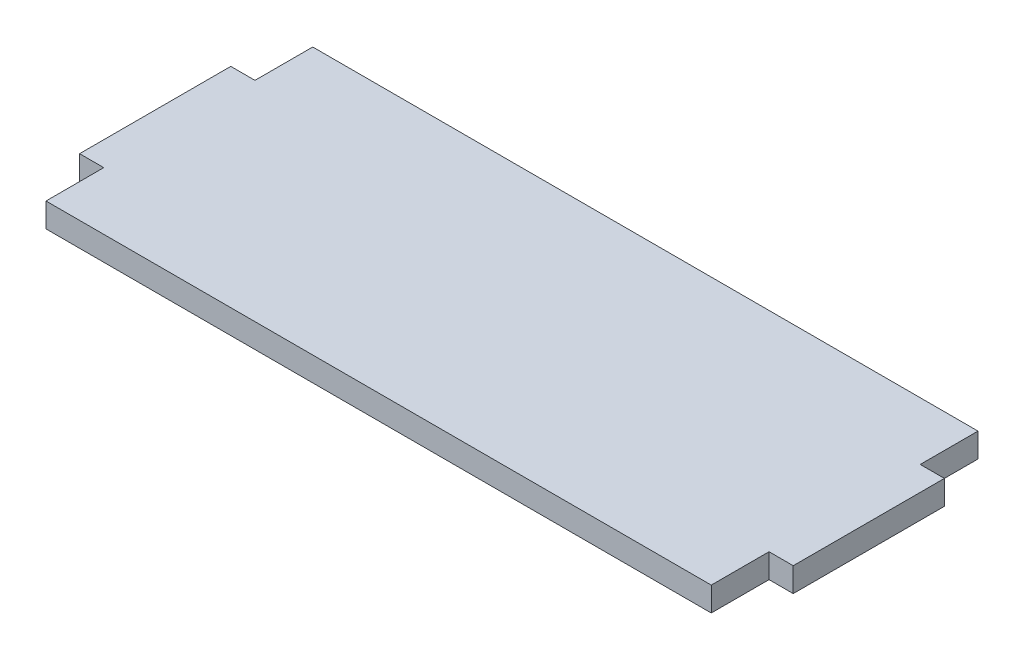
ISO-10303-21;
HEADER;
FILE_DESCRIPTION(('STEP AP214'),'2;1');
FILE_NAME('part.step','',(''),(''),'','','');
FILE_SCHEMA(('AUTOMOTIVE_DESIGN { 1 0 10303 214 1 1 1 1 }'));
ENDSEC;
DATA;
#1=APPLICATION_CONTEXT('core data for automotive mechanical design processes');
#2=APPLICATION_PROTOCOL_DEFINITION('international standard','automotive_design',2000,#1);
#3=PRODUCT_CONTEXT('',#1,'mechanical');
#4=PRODUCT('Part','Part','',(#3));
#5=PRODUCT_RELATED_PRODUCT_CATEGORY('part','',(#4));
#6=PRODUCT_DEFINITION_FORMATION('','',#4);
#7=PRODUCT_DEFINITION_CONTEXT('part definition',#1,'design');
#8=PRODUCT_DEFINITION('design','',#6,#7);
#9=PRODUCT_DEFINITION_SHAPE('','',#8);
#10=(LENGTH_UNIT() NAMED_UNIT(*) SI_UNIT(.MILLI.,.METRE.));
#11=(NAMED_UNIT(*) PLANE_ANGLE_UNIT() SI_UNIT($,.RADIAN.));
#12=(NAMED_UNIT(*) SI_UNIT($,.STERADIAN.) SOLID_ANGLE_UNIT());
#13=UNCERTAINTY_MEASURE_WITH_UNIT(LENGTH_MEASURE(1.E-05),#10,'distance_accuracy_value','');
#14=(GEOMETRIC_REPRESENTATION_CONTEXT(3) GLOBAL_UNCERTAINTY_ASSIGNED_CONTEXT((#13)) GLOBAL_UNIT_ASSIGNED_CONTEXT((#10,
#11,#12)) REPRESENTATION_CONTEXT('',''));
#15=CARTESIAN_POINT('',(0.,0.,0.));
#16=DIRECTION('',(0.,0.,1.));
#17=DIRECTION('',(1.,0.,0.));
#18=AXIS2_PLACEMENT_3D('',#15,#16,#17);
#19=CARTESIAN_POINT('',(-8.00000000000001,8.,0.));
#20=DIRECTION('',(1.,0.,0.));
#21=DIRECTION('',(0.,0.,-1.));
#22=AXIS2_PLACEMENT_3D('',#19,#20,#21);
#23=PLANE('',#22);
#24=DIRECTION('',(0.,0.,1.));
#25=VECTOR('',#24,1.);
#26=CARTESIAN_POINT('',(-8.00000000000001,0.,0.));
#27=LINE('',#26,#25);
#28=CARTESIAN_POINT('',(-8.,0.,-69.105));
#29=VERTEX_POINT('',#28);
#30=CARTESIAN_POINT('',(-8.00000000000001,0.,-19.105));
#31=VERTEX_POINT('',#30);
#32=EDGE_CURVE('E202',#29,#31,#27,.T.);
#33=ORIENTED_EDGE('',*,*,#32,.T.);
#34=DIRECTION('',(0.,-1.,0.));
#35=VECTOR('',#34,1.);
#36=CARTESIAN_POINT('',(-8.00000000000001,8.,-19.105));
#37=LINE('',#36,#35);
#38=CARTESIAN_POINT('',(-8.00000000000001,8.,-19.105));
#39=VERTEX_POINT('',#38);
#40=EDGE_CURVE('E11',#39,#31,#37,.T.);
#41=ORIENTED_EDGE('',*,*,#40,.F.);
#42=DIRECTION('',(0.,0.,1.));
#43=VECTOR('',#42,1.);
#44=CARTESIAN_POINT('',(-8.00000000000001,8.,0.));
#45=LINE('',#44,#43);
#46=CARTESIAN_POINT('',(-8.,8.,-69.105));
#47=VERTEX_POINT('',#46);
#48=EDGE_CURVE('E167',#47,#39,#45,.T.);
#49=ORIENTED_EDGE('',*,*,#48,.F.);
#50=DIRECTION('',(0.,-1.,0.));
#51=VECTOR('',#50,1.);
#52=CARTESIAN_POINT('',(-8.,8.,-69.105));
#53=LINE('',#52,#51);
#54=EDGE_CURVE('E57',#47,#29,#53,.T.);
#55=ORIENTED_EDGE('',*,*,#54,.T.);
#56=EDGE_LOOP('',(#33,#41,#49,#55));
#57=FACE_BOUND('',#56,.T.);
#58=ADVANCED_FACE('F41',(#57),#23,.F.);
#59=CARTESIAN_POINT('',(0.,8.,-19.105));
#60=DIRECTION('',(0.,0.,-1.));
#61=DIRECTION('',(-1.,0.,0.));
#62=AXIS2_PLACEMENT_3D('',#59,#60,#61);
#63=PLANE('',#62);
#64=DIRECTION('',(1.,0.,0.));
#65=VECTOR('',#64,1.);
#66=CARTESIAN_POINT('',(0.,0.,-19.105));
#67=LINE('',#66,#65);
#68=CARTESIAN_POINT('',(0.,0.,-19.105));
#69=VERTEX_POINT('',#68);
#70=EDGE_CURVE('E200',#31,#69,#67,.T.);
#71=ORIENTED_EDGE('',*,*,#70,.T.);
#72=DIRECTION('',(0.,-1.,0.));
#73=VECTOR('',#72,1.);
#74=CARTESIAN_POINT('',(0.,8.,-19.105));
#75=LINE('',#74,#73);
#76=CARTESIAN_POINT('',(0.,8.,-19.105));
#77=VERTEX_POINT('',#76);
#78=EDGE_CURVE('E49',#77,#69,#75,.T.);
#79=ORIENTED_EDGE('',*,*,#78,.F.);
#80=DIRECTION('',(1.,0.,0.));
#81=VECTOR('',#80,1.);
#82=CARTESIAN_POINT('',(0.,8.,-19.105));
#83=LINE('',#82,#81);
#84=EDGE_CURVE('E107',#39,#77,#83,.T.);
#85=ORIENTED_EDGE('',*,*,#84,.F.);
#86=ORIENTED_EDGE('',*,*,#40,.T.);
#87=EDGE_LOOP('',(#71,#79,#85,#86));
#88=FACE_BOUND('',#87,.T.);
#89=ADVANCED_FACE('F201',(#88),#63,.F.);
#90=CARTESIAN_POINT('',(0.,8.,0.));
#91=DIRECTION('',(-1.,0.,0.));
#92=DIRECTION('',(0.,0.,1.));
#93=AXIS2_PLACEMENT_3D('',#90,#91,#92);
#94=PLANE('',#93);
#95=DIRECTION('',(0.,0.,-1.));
#96=VECTOR('',#95,1.);
#97=CARTESIAN_POINT('',(0.,0.,0.));
#98=LINE('',#97,#96);
#99=CARTESIAN_POINT('',(0.,0.,0.));
#100=VERTEX_POINT('',#99);
#101=EDGE_CURVE('E176',#100,#69,#98,.T.);
#102=ORIENTED_EDGE('',*,*,#101,.F.);
#103=DIRECTION('',(0.,-1.,0.));
#104=VECTOR('',#103,1.);
#105=CARTESIAN_POINT('',(0.,8.,0.));
#106=LINE('',#105,#104);
#107=CARTESIAN_POINT('',(0.,8.,0.));
#108=VERTEX_POINT('',#107);
#109=EDGE_CURVE('E195',#108,#100,#106,.T.);
#110=ORIENTED_EDGE('',*,*,#109,.F.);
#111=DIRECTION('',(0.,0.,-1.));
#112=VECTOR('',#111,1.);
#113=CARTESIAN_POINT('',(0.,8.,0.));
#114=LINE('',#113,#112);
#115=EDGE_CURVE('E158',#108,#77,#114,.T.);
#116=ORIENTED_EDGE('',*,*,#115,.T.);
#117=ORIENTED_EDGE('',*,*,#78,.T.);
#118=EDGE_LOOP('',(#102,#110,#116,#117));
#119=FACE_BOUND('',#118,.T.);
#120=ADVANCED_FACE('F198',(#119),#94,.T.);
#121=CARTESIAN_POINT('',(0.,8.,0.));
#122=DIRECTION('',(0.,0.,-1.));
#123=DIRECTION('',(-1.,0.,0.));
#124=AXIS2_PLACEMENT_3D('',#121,#122,#123);
#125=PLANE('',#124);
#126=DIRECTION('',(1.,0.,0.));
#127=VECTOR('',#126,1.);
#128=CARTESIAN_POINT('',(0.,0.,0.));
#129=LINE('',#128,#127);
#130=CARTESIAN_POINT('',(220.,0.,0.));
#131=VERTEX_POINT('',#130);
#132=EDGE_CURVE('E207',#100,#131,#129,.T.);
#133=ORIENTED_EDGE('',*,*,#132,.T.);
#134=DIRECTION('',(0.,-1.,0.));
#135=VECTOR('',#134,1.);
#136=CARTESIAN_POINT('',(220.,8.,0.));
#137=LINE('',#136,#135);
#138=CARTESIAN_POINT('',(220.,8.,0.));
#139=VERTEX_POINT('',#138);
#140=EDGE_CURVE('E192',#139,#131,#137,.T.);
#141=ORIENTED_EDGE('',*,*,#140,.F.);
#142=DIRECTION('',(1.,0.,0.));
#143=VECTOR('',#142,1.);
#144=CARTESIAN_POINT('',(0.,8.,0.));
#145=LINE('',#144,#143);
#146=EDGE_CURVE('E163',#108,#139,#145,.T.);
#147=ORIENTED_EDGE('',*,*,#146,.F.);
#148=ORIENTED_EDGE('',*,*,#109,.T.);
#149=EDGE_LOOP('',(#133,#141,#147,#148));
#150=FACE_BOUND('',#149,.T.);
#151=ADVANCED_FACE('F246',(#150),#125,.F.);
#152=CARTESIAN_POINT('',(220.,8.,0.));
#153=DIRECTION('',(-1.,0.,0.));
#154=DIRECTION('',(0.,0.,1.));
#155=AXIS2_PLACEMENT_3D('',#152,#153,#154);
#156=PLANE('',#155);
#157=DIRECTION('',(0.,0.,-1.));
#158=VECTOR('',#157,1.);
#159=CARTESIAN_POINT('',(220.,0.,0.));
#160=LINE('',#159,#158);
#161=CARTESIAN_POINT('',(220.,0.,-19.105));
#162=VERTEX_POINT('',#161);
#163=EDGE_CURVE('E208',#131,#162,#160,.T.);
#164=ORIENTED_EDGE('',*,*,#163,.T.);
#165=DIRECTION('',(0.,-1.,0.));
#166=VECTOR('',#165,1.);
#167=CARTESIAN_POINT('',(220.,8.,-19.105));
#168=LINE('',#167,#166);
#169=CARTESIAN_POINT('',(220.,8.,-19.105));
#170=VERTEX_POINT('',#169);
#171=EDGE_CURVE('E190',#170,#162,#168,.T.);
#172=ORIENTED_EDGE('',*,*,#171,.F.);
#173=DIRECTION('',(0.,0.,-1.));
#174=VECTOR('',#173,1.);
#175=CARTESIAN_POINT('',(220.,8.,0.));
#176=LINE('',#175,#174);
#177=EDGE_CURVE('E166',#139,#170,#176,.T.);
#178=ORIENTED_EDGE('',*,*,#177,.F.);
#179=ORIENTED_EDGE('',*,*,#140,.T.);
#180=EDGE_LOOP('',(#164,#172,#178,#179));
#181=FACE_BOUND('',#180,.T.);
#182=ADVANCED_FACE('F241',(#181),#156,.F.);
#183=CARTESIAN_POINT('',(0.,8.,-19.105));
#184=DIRECTION('',(0.,0.,1.));
#185=DIRECTION('',(1.,0.,0.));
#186=AXIS2_PLACEMENT_3D('',#183,#184,#185);
#187=PLANE('',#186);
#188=DIRECTION('',(-1.,0.,0.));
#189=VECTOR('',#188,1.);
#190=CARTESIAN_POINT('',(0.,0.,-19.105));
#191=LINE('',#190,#189);
#192=CARTESIAN_POINT('',(228.,0.,-19.105));
#193=VERTEX_POINT('',#192);
#194=EDGE_CURVE('E214',#193,#162,#191,.T.);
#195=ORIENTED_EDGE('',*,*,#194,.F.);
#196=DIRECTION('',(0.,-1.,0.));
#197=VECTOR('',#196,1.);
#198=CARTESIAN_POINT('',(228.,8.,-19.105));
#199=LINE('',#198,#197);
#200=CARTESIAN_POINT('',(228.,8.,-19.105));
#201=VERTEX_POINT('',#200);
#202=EDGE_CURVE('E188',#201,#193,#199,.T.);
#203=ORIENTED_EDGE('',*,*,#202,.F.);
#204=DIRECTION('',(-1.,0.,0.));
#205=VECTOR('',#204,1.);
#206=CARTESIAN_POINT('',(0.,8.,-19.105));
#207=LINE('',#206,#205);
#208=EDGE_CURVE('E247',#201,#170,#207,.T.);
#209=ORIENTED_EDGE('',*,*,#208,.T.);
#210=ORIENTED_EDGE('',*,*,#171,.T.);
#211=EDGE_LOOP('',(#195,#203,#209,#210));
#212=FACE_BOUND('',#211,.T.);
#213=ADVANCED_FACE('F238',(#212),#187,.T.);
#214=CARTESIAN_POINT('',(228.,8.,-1.26565424807268E-13));
#215=DIRECTION('',(1.,0.,0.));
#216=DIRECTION('',(0.,0.,-1.));
#217=AXIS2_PLACEMENT_3D('',#214,#215,#216);
#218=PLANE('',#217);
#219=DIRECTION('',(0.,0.,1.));
#220=VECTOR('',#219,1.);
#221=CARTESIAN_POINT('',(228.,0.,-1.26565424807268E-13));
#222=LINE('',#221,#220);
#223=CARTESIAN_POINT('',(228.,0.,-69.105));
#224=VERTEX_POINT('',#223);
#225=EDGE_CURVE('E218',#224,#193,#222,.T.);
#226=ORIENTED_EDGE('',*,*,#225,.F.);
#227=DIRECTION('',(0.,-1.,0.));
#228=VECTOR('',#227,1.);
#229=CARTESIAN_POINT('',(228.,8.,-69.105));
#230=LINE('',#229,#228);
#231=CARTESIAN_POINT('',(228.,8.,-69.105));
#232=VERTEX_POINT('',#231);
#233=EDGE_CURVE('E186',#232,#224,#230,.T.);
#234=ORIENTED_EDGE('',*,*,#233,.F.);
#235=DIRECTION('',(0.,0.,1.));
#236=VECTOR('',#235,1.);
#237=CARTESIAN_POINT('',(228.,8.,-1.26565424807268E-13));
#238=LINE('',#237,#236);
#239=EDGE_CURVE('E234',#232,#201,#238,.T.);
#240=ORIENTED_EDGE('',*,*,#239,.T.);
#241=ORIENTED_EDGE('',*,*,#202,.T.);
#242=EDGE_LOOP('',(#226,#234,#240,#241));
#243=FACE_BOUND('',#242,.T.);
#244=ADVANCED_FACE('F229',(#243),#218,.T.);
#245=CARTESIAN_POINT('',(0.,8.,-69.105));
#246=DIRECTION('',(0.,0.,1.));
#247=DIRECTION('',(1.,0.,0.));
#248=AXIS2_PLACEMENT_3D('',#245,#246,#247);
#249=PLANE('',#248);
#250=DIRECTION('',(-1.,0.,0.));
#251=VECTOR('',#250,1.);
#252=CARTESIAN_POINT('',(0.,0.,-69.105));
#253=LINE('',#252,#251);
#254=CARTESIAN_POINT('',(220.,0.,-69.105));
#255=VERTEX_POINT('',#254);
#256=EDGE_CURVE('E220',#224,#255,#253,.T.);
#257=ORIENTED_EDGE('',*,*,#256,.T.);
#258=DIRECTION('',(0.,-1.,0.));
#259=VECTOR('',#258,1.);
#260=CARTESIAN_POINT('',(220.,8.,-69.105));
#261=LINE('',#260,#259);
#262=CARTESIAN_POINT('',(220.,8.,-69.105));
#263=VERTEX_POINT('',#262);
#264=EDGE_CURVE('E183',#263,#255,#261,.T.);
#265=ORIENTED_EDGE('',*,*,#264,.F.);
#266=DIRECTION('',(-1.,0.,0.));
#267=VECTOR('',#266,1.);
#268=CARTESIAN_POINT('',(0.,8.,-69.105));
#269=LINE('',#268,#267);
#270=EDGE_CURVE('E250',#232,#263,#269,.T.);
#271=ORIENTED_EDGE('',*,*,#270,.F.);
#272=ORIENTED_EDGE('',*,*,#233,.T.);
#273=EDGE_LOOP('',(#257,#265,#271,#272));
#274=FACE_BOUND('',#273,.T.);
#275=ADVANCED_FACE('F277',(#274),#249,.F.);
#276=CARTESIAN_POINT('',(220.,0.,-88.21));
#277=VERTEX_POINT('',#276);
#278=EDGE_CURVE('E215',#255,#277,#160,.T.);
#279=ORIENTED_EDGE('',*,*,#278,.T.);
#280=DIRECTION('',(0.,-1.,0.));
#281=VECTOR('',#280,1.);
#282=CARTESIAN_POINT('',(220.,8.,-88.21));
#283=LINE('',#282,#281);
#284=CARTESIAN_POINT('',(220.,8.,-88.21));
#285=VERTEX_POINT('',#284);
#286=EDGE_CURVE('E144',#285,#277,#283,.T.);
#287=ORIENTED_EDGE('',*,*,#286,.F.);
#288=EDGE_CURVE('E152',#263,#285,#176,.T.);
#289=ORIENTED_EDGE('',*,*,#288,.F.);
#290=ORIENTED_EDGE('',*,*,#264,.T.);
#291=EDGE_LOOP('',(#279,#287,#289,#290));
#292=FACE_BOUND('',#291,.T.);
#293=ADVANCED_FACE('F280',(#292),#156,.F.);
#294=CARTESIAN_POINT('',(0.,8.,-88.21));
#295=DIRECTION('',(0.,0.,-1.));
#296=DIRECTION('',(-1.,0.,0.));
#297=AXIS2_PLACEMENT_3D('',#294,#295,#296);
#298=PLANE('',#297);
#299=DIRECTION('',(1.,0.,0.));
#300=VECTOR('',#299,1.);
#301=CARTESIAN_POINT('',(0.,0.,-88.21));
#302=LINE('',#301,#300);
#303=CARTESIAN_POINT('',(0.,0.,-88.21));
#304=VERTEX_POINT('',#303);
#305=EDGE_CURVE('E140',#304,#277,#302,.T.);
#306=ORIENTED_EDGE('',*,*,#305,.F.);
#307=DIRECTION('',(0.,-1.,0.));
#308=VECTOR('',#307,1.);
#309=CARTESIAN_POINT('',(0.,8.,-88.21));
#310=LINE('',#309,#308);
#311=CARTESIAN_POINT('',(0.,8.,-88.21));
#312=VERTEX_POINT('',#311);
#313=EDGE_CURVE('E135',#312,#304,#310,.T.);
#314=ORIENTED_EDGE('',*,*,#313,.F.);
#315=DIRECTION('',(1.,0.,0.));
#316=VECTOR('',#315,1.);
#317=CARTESIAN_POINT('',(0.,8.,-88.21));
#318=LINE('',#317,#316);
#319=EDGE_CURVE('E138',#312,#285,#318,.T.);
#320=ORIENTED_EDGE('',*,*,#319,.T.);
#321=ORIENTED_EDGE('',*,*,#286,.T.);
#322=EDGE_LOOP('',(#306,#314,#320,#321));
#323=FACE_BOUND('',#322,.T.);
#324=ADVANCED_FACE('F137',(#323),#298,.T.);
#325=CARTESIAN_POINT('',(0.,0.,-69.105));
#326=VERTEX_POINT('',#325);
#327=EDGE_CURVE('E172',#326,#304,#98,.T.);
#328=ORIENTED_EDGE('',*,*,#327,.F.);
#329=DIRECTION('',(0.,-1.,0.));
#330=VECTOR('',#329,1.);
#331=CARTESIAN_POINT('',(0.,8.,-69.105));
#332=LINE('',#331,#330);
#333=CARTESIAN_POINT('',(0.,8.,-69.105));
#334=VERTEX_POINT('',#333);
#335=EDGE_CURVE('E95',#334,#326,#332,.T.);
#336=ORIENTED_EDGE('',*,*,#335,.F.);
#337=EDGE_CURVE('E150',#334,#312,#114,.T.);
#338=ORIENTED_EDGE('',*,*,#337,.T.);
#339=ORIENTED_EDGE('',*,*,#313,.T.);
#340=EDGE_LOOP('',(#328,#336,#338,#339));
#341=FACE_BOUND('',#340,.T.);
#342=ADVANCED_FACE('F155',(#341),#94,.T.);
#343=CARTESIAN_POINT('',(0.,8.,-69.105));
#344=DIRECTION('',(0.,0.,-1.));
#345=DIRECTION('',(-1.,0.,0.));
#346=AXIS2_PLACEMENT_3D('',#343,#344,#345);
#347=PLANE('',#346);
#348=DIRECTION('',(1.,0.,0.));
#349=VECTOR('',#348,1.);
#350=CARTESIAN_POINT('',(0.,0.,-69.105));
#351=LINE('',#350,#349);
#352=EDGE_CURVE('E168',#29,#326,#351,.T.);
#353=ORIENTED_EDGE('',*,*,#352,.F.);
#354=ORIENTED_EDGE('',*,*,#54,.F.);
#355=DIRECTION('',(1.,0.,0.));
#356=VECTOR('',#355,1.);
#357=CARTESIAN_POINT('',(0.,8.,-69.105));
#358=LINE('',#357,#356);
#359=EDGE_CURVE('E156',#47,#334,#358,.T.);
#360=ORIENTED_EDGE('',*,*,#359,.T.);
#361=ORIENTED_EDGE('',*,*,#335,.T.);
#362=EDGE_LOOP('',(#353,#354,#360,#361));
#363=FACE_BOUND('',#362,.T.);
#364=ADVANCED_FACE('F253',(#363),#347,.T.);
#365=CARTESIAN_POINT('',(0.,8.,0.));
#366=DIRECTION('',(0.,1.,0.));
#367=DIRECTION('',(0.,0.,1.));
#368=AXIS2_PLACEMENT_3D('',#365,#366,#367);
#369=PLANE('',#368);
#370=ORIENTED_EDGE('',*,*,#48,.T.);
#371=ORIENTED_EDGE('',*,*,#84,.T.);
#372=ORIENTED_EDGE('',*,*,#115,.F.);
#373=ORIENTED_EDGE('',*,*,#146,.T.);
#374=ORIENTED_EDGE('',*,*,#177,.T.);
#375=ORIENTED_EDGE('',*,*,#208,.F.);
#376=ORIENTED_EDGE('',*,*,#239,.F.);
#377=ORIENTED_EDGE('',*,*,#270,.T.);
#378=ORIENTED_EDGE('',*,*,#288,.T.);
#379=ORIENTED_EDGE('',*,*,#319,.F.);
#380=ORIENTED_EDGE('',*,*,#337,.F.);
#381=ORIENTED_EDGE('',*,*,#359,.F.);
#382=EDGE_LOOP('',(#370,#371,#372,#373,#374,#375,#376,#377,#378,#379,#380,#381));
#383=FACE_BOUND('',#382,.T.);
#384=ADVANCED_FACE('F148',(#383),#369,.T.);
#385=CARTESIAN_POINT('',(0.,0.,0.));
#386=DIRECTION('',(0.,1.,0.));
#387=DIRECTION('',(0.,0.,1.));
#388=AXIS2_PLACEMENT_3D('',#385,#386,#387);
#389=PLANE('',#388);
#390=ORIENTED_EDGE('',*,*,#32,.F.);
#391=ORIENTED_EDGE('',*,*,#352,.T.);
#392=ORIENTED_EDGE('',*,*,#327,.T.);
#393=ORIENTED_EDGE('',*,*,#305,.T.);
#394=ORIENTED_EDGE('',*,*,#278,.F.);
#395=ORIENTED_EDGE('',*,*,#256,.F.);
#396=ORIENTED_EDGE('',*,*,#225,.T.);
#397=ORIENTED_EDGE('',*,*,#194,.T.);
#398=ORIENTED_EDGE('',*,*,#163,.F.);
#399=ORIENTED_EDGE('',*,*,#132,.F.);
#400=ORIENTED_EDGE('',*,*,#101,.T.);
#401=ORIENTED_EDGE('',*,*,#70,.F.);
#402=EDGE_LOOP('',(#390,#391,#392,#393,#394,#395,#396,#397,#398,#399,#400,#401));
#403=FACE_BOUND('',#402,.T.);
#404=ADVANCED_FACE('F205',(#403),#389,.F.);
#405=CLOSED_SHELL('',(#58,#89,#120,#151,#182,#213,#244,#275,#293,#324,#342,#364,#384,#404));
#406=MANIFOLD_SOLID_BREP('B2',#405);
#407=ADVANCED_BREP_SHAPE_REPRESENTATION('',(#18,#406),#14);
#408=SHAPE_DEFINITION_REPRESENTATION(#9,#407);
ENDSEC;
END-ISO-10303-21;
